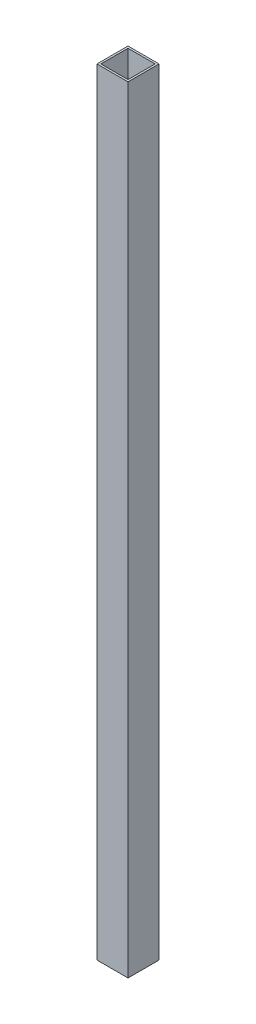
ISO-10303-21;
HEADER;
FILE_DESCRIPTION(('STEP AP214'),'2;1');
FILE_NAME('part.step','',(''),(''),'','','');
FILE_SCHEMA(('AUTOMOTIVE_DESIGN { 1 0 10303 214 1 1 1 1 }'));
ENDSEC;
DATA;
#1=APPLICATION_CONTEXT('core data for automotive mechanical design processes');
#2=APPLICATION_PROTOCOL_DEFINITION('international standard','automotive_design',2000,#1);
#3=PRODUCT_CONTEXT('',#1,'mechanical');
#4=PRODUCT('Part','Part','',(#3));
#5=PRODUCT_RELATED_PRODUCT_CATEGORY('part','',(#4));
#6=PRODUCT_DEFINITION_FORMATION('','',#4);
#7=PRODUCT_DEFINITION_CONTEXT('part definition',#1,'design');
#8=PRODUCT_DEFINITION('design','',#6,#7);
#9=PRODUCT_DEFINITION_SHAPE('','',#8);
#10=(LENGTH_UNIT() NAMED_UNIT(*) SI_UNIT(.MILLI.,.METRE.));
#11=(NAMED_UNIT(*) PLANE_ANGLE_UNIT() SI_UNIT($,.RADIAN.));
#12=(NAMED_UNIT(*) SI_UNIT($,.STERADIAN.) SOLID_ANGLE_UNIT());
#13=UNCERTAINTY_MEASURE_WITH_UNIT(LENGTH_MEASURE(1.E-05),#10,'distance_accuracy_value','');
#14=(GEOMETRIC_REPRESENTATION_CONTEXT(3) GLOBAL_UNCERTAINTY_ASSIGNED_CONTEXT((#13)) GLOBAL_UNIT_ASSIGNED_CONTEXT((#10,
#11,#12)) REPRESENTATION_CONTEXT('',''));
#15=CARTESIAN_POINT('',(0.,0.,0.));
#16=DIRECTION('',(0.,0.,1.));
#17=DIRECTION('',(1.,0.,0.));
#18=AXIS2_PLACEMENT_3D('',#15,#16,#17);
#19=CARTESIAN_POINT('',(0.,635.,0.));
#20=DIRECTION('',(0.,-1.,0.));
#21=DIRECTION('',(0.,0.,-1.));
#22=AXIS2_PLACEMENT_3D('',#19,#20,#21);
#23=PLANE('',#22);
#24=DIRECTION('',(0.,0.,1.));
#25=VECTOR('',#24,1.);
#26=CARTESIAN_POINT('',(-12.7,635.,-12.7));
#27=LINE('',#26,#25);
#28=CARTESIAN_POINT('',(-12.7,635.,-12.7));
#29=VERTEX_POINT('',#28);
#30=CARTESIAN_POINT('',(-12.7,635.,12.7));
#31=VERTEX_POINT('',#30);
#32=EDGE_CURVE('E133',#29,#31,#27,.T.);
#33=ORIENTED_EDGE('',*,*,#32,.T.);
#34=DIRECTION('',(1.,0.,0.));
#35=VECTOR('',#34,1.);
#36=CARTESIAN_POINT('',(12.7,635.,12.7));
#37=LINE('',#36,#35);
#38=CARTESIAN_POINT('',(12.7,635.,12.7));
#39=VERTEX_POINT('',#38);
#40=EDGE_CURVE('E136',#31,#39,#37,.T.);
#41=ORIENTED_EDGE('',*,*,#40,.T.);
#42=DIRECTION('',(0.,0.,-1.));
#43=VECTOR('',#42,1.);
#44=CARTESIAN_POINT('',(12.7,635.,-12.7));
#45=LINE('',#44,#43);
#46=CARTESIAN_POINT('',(12.7,635.,-12.7));
#47=VERTEX_POINT('',#46);
#48=EDGE_CURVE('E139',#39,#47,#45,.T.);
#49=ORIENTED_EDGE('',*,*,#48,.T.);
#50=DIRECTION('',(-1.,0.,0.));
#51=VECTOR('',#50,1.);
#52=CARTESIAN_POINT('',(12.7,635.,-12.7));
#53=LINE('',#52,#51);
#54=EDGE_CURVE('E141',#47,#29,#53,.T.);
#55=ORIENTED_EDGE('',*,*,#54,.T.);
#56=EDGE_LOOP('',(#33,#41,#49,#55));
#57=FACE_BOUND('',#56,.T.);
#58=DIRECTION('',(0.,0.,1.));
#59=VECTOR('',#58,1.);
#60=CARTESIAN_POINT('',(-11.1125,635.,-11.1125));
#61=LINE('',#60,#59);
#62=CARTESIAN_POINT('',(-11.1125,635.,-11.1125));
#63=VERTEX_POINT('',#62);
#64=CARTESIAN_POINT('',(-11.1125,635.,11.1125));
#65=VERTEX_POINT('',#64);
#66=EDGE_CURVE('E97',#63,#65,#61,.T.);
#67=ORIENTED_EDGE('',*,*,#66,.F.);
#68=DIRECTION('',(-1.,0.,0.));
#69=VECTOR('',#68,1.);
#70=CARTESIAN_POINT('',(11.1125,635.,-11.1125));
#71=LINE('',#70,#69);
#72=CARTESIAN_POINT('',(11.1125,635.,-11.1125));
#73=VERTEX_POINT('',#72);
#74=EDGE_CURVE('E119',#73,#63,#71,.T.);
#75=ORIENTED_EDGE('',*,*,#74,.F.);
#76=DIRECTION('',(0.,0.,-1.));
#77=VECTOR('',#76,1.);
#78=CARTESIAN_POINT('',(11.1125,635.,-11.1125));
#79=LINE('',#78,#77);
#80=CARTESIAN_POINT('',(11.1125,635.,11.1125));
#81=VERTEX_POINT('',#80);
#82=EDGE_CURVE('E117',#81,#73,#79,.T.);
#83=ORIENTED_EDGE('',*,*,#82,.F.);
#84=DIRECTION('',(1.,0.,0.));
#85=VECTOR('',#84,1.);
#86=CARTESIAN_POINT('',(11.1125,635.,11.1125));
#87=LINE('',#86,#85);
#88=EDGE_CURVE('E105',#65,#81,#87,.T.);
#89=ORIENTED_EDGE('',*,*,#88,.F.);
#90=EDGE_LOOP('',(#67,#75,#83,#89));
#91=FACE_BOUND('',#90,.T.);
#92=ADVANCED_FACE('F32',(#57,#91),#23,.F.);
#93=CARTESIAN_POINT('',(0.,0.,0.));
#94=DIRECTION('',(0.,-1.,0.));
#95=DIRECTION('',(0.,0.,-1.));
#96=AXIS2_PLACEMENT_3D('',#93,#94,#95);
#97=PLANE('',#96);
#98=DIRECTION('',(0.,0.,1.));
#99=VECTOR('',#98,1.);
#100=CARTESIAN_POINT('',(-12.7,0.,-12.7));
#101=LINE('',#100,#99);
#102=CARTESIAN_POINT('',(-12.7,0.,-12.7));
#103=VERTEX_POINT('',#102);
#104=CARTESIAN_POINT('',(-12.7,0.,12.7));
#105=VERTEX_POINT('',#104);
#106=EDGE_CURVE('E113',#103,#105,#101,.T.);
#107=ORIENTED_EDGE('',*,*,#106,.F.);
#108=DIRECTION('',(-1.,0.,0.));
#109=VECTOR('',#108,1.);
#110=CARTESIAN_POINT('',(12.7,0.,-12.7));
#111=LINE('',#110,#109);
#112=CARTESIAN_POINT('',(12.7,0.,-12.7));
#113=VERTEX_POINT('',#112);
#114=EDGE_CURVE('E137',#113,#103,#111,.T.);
#115=ORIENTED_EDGE('',*,*,#114,.F.);
#116=DIRECTION('',(0.,0.,-1.));
#117=VECTOR('',#116,1.);
#118=CARTESIAN_POINT('',(12.7,0.,-12.7));
#119=LINE('',#118,#117);
#120=CARTESIAN_POINT('',(12.7,0.,12.7));
#121=VERTEX_POINT('',#120);
#122=EDGE_CURVE('E148',#121,#113,#119,.T.);
#123=ORIENTED_EDGE('',*,*,#122,.F.);
#124=DIRECTION('',(1.,0.,0.));
#125=VECTOR('',#124,1.);
#126=CARTESIAN_POINT('',(12.7,0.,12.7));
#127=LINE('',#126,#125);
#128=EDGE_CURVE('E146',#105,#121,#127,.T.);
#129=ORIENTED_EDGE('',*,*,#128,.F.);
#130=EDGE_LOOP('',(#107,#115,#123,#129));
#131=FACE_BOUND('',#130,.T.);
#132=DIRECTION('',(-1.,0.,0.));
#133=VECTOR('',#132,1.);
#134=CARTESIAN_POINT('',(11.1125,0.,-11.1125));
#135=LINE('',#134,#133);
#136=CARTESIAN_POINT('',(11.1125,0.,-11.1125));
#137=VERTEX_POINT('',#136);
#138=CARTESIAN_POINT('',(-11.1125,0.,-11.1125));
#139=VERTEX_POINT('',#138);
#140=EDGE_CURVE('E106',#137,#139,#135,.T.);
#141=ORIENTED_EDGE('',*,*,#140,.T.);
#142=DIRECTION('',(0.,0.,1.));
#143=VECTOR('',#142,1.);
#144=CARTESIAN_POINT('',(-11.1125,0.,-11.1125));
#145=LINE('',#144,#143);
#146=CARTESIAN_POINT('',(-11.1125,0.,11.1125));
#147=VERTEX_POINT('',#146);
#148=EDGE_CURVE('E55',#139,#147,#145,.T.);
#149=ORIENTED_EDGE('',*,*,#148,.T.);
#150=DIRECTION('',(1.,0.,0.));
#151=VECTOR('',#150,1.);
#152=CARTESIAN_POINT('',(11.1125,0.,11.1125));
#153=LINE('',#152,#151);
#154=CARTESIAN_POINT('',(11.1125,0.,11.1125));
#155=VERTEX_POINT('',#154);
#156=EDGE_CURVE('E112',#147,#155,#153,.T.);
#157=ORIENTED_EDGE('',*,*,#156,.T.);
#158=DIRECTION('',(0.,0.,-1.));
#159=VECTOR('',#158,1.);
#160=CARTESIAN_POINT('',(11.1125,0.,-11.1125));
#161=LINE('',#160,#159);
#162=EDGE_CURVE('E125',#155,#137,#161,.T.);
#163=ORIENTED_EDGE('',*,*,#162,.T.);
#164=EDGE_LOOP('',(#141,#149,#157,#163));
#165=FACE_BOUND('',#164,.T.);
#166=ADVANCED_FACE('F166',(#131,#165),#97,.T.);
#167=CARTESIAN_POINT('',(-12.7,635.,-12.7));
#168=DIRECTION('',(1.,0.,0.));
#169=DIRECTION('',(0.,0.,-1.));
#170=AXIS2_PLACEMENT_3D('',#167,#168,#169);
#171=PLANE('',#170);
#172=ORIENTED_EDGE('',*,*,#106,.T.);
#173=DIRECTION('',(0.,-1.,0.));
#174=VECTOR('',#173,1.);
#175=CARTESIAN_POINT('',(-12.7,635.,12.7));
#176=LINE('',#175,#174);
#177=EDGE_CURVE('E11',#31,#105,#176,.T.);
#178=ORIENTED_EDGE('',*,*,#177,.F.);
#179=ORIENTED_EDGE('',*,*,#32,.F.);
#180=DIRECTION('',(0.,-1.,0.));
#181=VECTOR('',#180,1.);
#182=CARTESIAN_POINT('',(-12.7,635.,-12.7));
#183=LINE('',#182,#181);
#184=EDGE_CURVE('E143',#29,#103,#183,.T.);
#185=ORIENTED_EDGE('',*,*,#184,.T.);
#186=EDGE_LOOP('',(#172,#178,#179,#185));
#187=FACE_BOUND('',#186,.T.);
#188=ADVANCED_FACE('F34',(#187),#171,.F.);
#189=CARTESIAN_POINT('',(12.7,635.,12.7));
#190=DIRECTION('',(0.,0.,-1.));
#191=DIRECTION('',(-1.,0.,0.));
#192=AXIS2_PLACEMENT_3D('',#189,#190,#191);
#193=PLANE('',#192);
#194=ORIENTED_EDGE('',*,*,#128,.T.);
#195=DIRECTION('',(0.,-1.,0.));
#196=VECTOR('',#195,1.);
#197=CARTESIAN_POINT('',(12.7,635.,12.7));
#198=LINE('',#197,#196);
#199=EDGE_CURVE('E40',#39,#121,#198,.T.);
#200=ORIENTED_EDGE('',*,*,#199,.F.);
#201=ORIENTED_EDGE('',*,*,#40,.F.);
#202=ORIENTED_EDGE('',*,*,#177,.T.);
#203=EDGE_LOOP('',(#194,#200,#201,#202));
#204=FACE_BOUND('',#203,.T.);
#205=ADVANCED_FACE('F176',(#204),#193,.F.);
#206=CARTESIAN_POINT('',(12.7,635.,-12.7));
#207=DIRECTION('',(-1.,0.,0.));
#208=DIRECTION('',(0.,0.,1.));
#209=AXIS2_PLACEMENT_3D('',#206,#207,#208);
#210=PLANE('',#209);
#211=ORIENTED_EDGE('',*,*,#122,.T.);
#212=DIRECTION('',(0.,-1.,0.));
#213=VECTOR('',#212,1.);
#214=CARTESIAN_POINT('',(12.7,635.,-12.7));
#215=LINE('',#214,#213);
#216=EDGE_CURVE('E153',#47,#113,#215,.T.);
#217=ORIENTED_EDGE('',*,*,#216,.F.);
#218=ORIENTED_EDGE('',*,*,#48,.F.);
#219=ORIENTED_EDGE('',*,*,#199,.T.);
#220=EDGE_LOOP('',(#211,#217,#218,#219));
#221=FACE_BOUND('',#220,.T.);
#222=ADVANCED_FACE('F160',(#221),#210,.F.);
#223=CARTESIAN_POINT('',(12.7,635.,-12.7));
#224=DIRECTION('',(0.,0.,1.));
#225=DIRECTION('',(1.,0.,0.));
#226=AXIS2_PLACEMENT_3D('',#223,#224,#225);
#227=PLANE('',#226);
#228=ORIENTED_EDGE('',*,*,#114,.T.);
#229=ORIENTED_EDGE('',*,*,#184,.F.);
#230=ORIENTED_EDGE('',*,*,#54,.F.);
#231=ORIENTED_EDGE('',*,*,#216,.T.);
#232=EDGE_LOOP('',(#228,#229,#230,#231));
#233=FACE_BOUND('',#232,.T.);
#234=ADVANCED_FACE('F170',(#233),#227,.F.);
#235=CARTESIAN_POINT('',(-11.1125,635.,-11.1125));
#236=DIRECTION('',(1.,0.,0.));
#237=DIRECTION('',(0.,0.,-1.));
#238=AXIS2_PLACEMENT_3D('',#235,#236,#237);
#239=PLANE('',#238);
#240=ORIENTED_EDGE('',*,*,#148,.F.);
#241=DIRECTION('',(0.,-1.,0.));
#242=VECTOR('',#241,1.);
#243=CARTESIAN_POINT('',(-11.1125,635.,-11.1125));
#244=LINE('',#243,#242);
#245=EDGE_CURVE('E101',#63,#139,#244,.T.);
#246=ORIENTED_EDGE('',*,*,#245,.F.);
#247=ORIENTED_EDGE('',*,*,#66,.T.);
#248=DIRECTION('',(0.,-1.,0.));
#249=VECTOR('',#248,1.);
#250=CARTESIAN_POINT('',(-11.1125,635.,11.1125));
#251=LINE('',#250,#249);
#252=EDGE_CURVE('E100',#65,#147,#251,.T.);
#253=ORIENTED_EDGE('',*,*,#252,.T.);
#254=EDGE_LOOP('',(#240,#246,#247,#253));
#255=FACE_BOUND('',#254,.T.);
#256=ADVANCED_FACE('F99',(#255),#239,.T.);
#257=CARTESIAN_POINT('',(11.1125,635.,11.1125));
#258=DIRECTION('',(0.,0.,-1.));
#259=DIRECTION('',(-1.,0.,0.));
#260=AXIS2_PLACEMENT_3D('',#257,#258,#259);
#261=PLANE('',#260);
#262=ORIENTED_EDGE('',*,*,#156,.F.);
#263=ORIENTED_EDGE('',*,*,#252,.F.);
#264=ORIENTED_EDGE('',*,*,#88,.T.);
#265=DIRECTION('',(0.,-1.,0.));
#266=VECTOR('',#265,1.);
#267=CARTESIAN_POINT('',(11.1125,635.,11.1125));
#268=LINE('',#267,#266);
#269=EDGE_CURVE('E114',#81,#155,#268,.T.);
#270=ORIENTED_EDGE('',*,*,#269,.T.);
#271=EDGE_LOOP('',(#262,#263,#264,#270));
#272=FACE_BOUND('',#271,.T.);
#273=ADVANCED_FACE('F109',(#272),#261,.T.);
#274=CARTESIAN_POINT('',(11.1125,635.,-11.1125));
#275=DIRECTION('',(-1.,0.,0.));
#276=DIRECTION('',(0.,0.,1.));
#277=AXIS2_PLACEMENT_3D('',#274,#275,#276);
#278=PLANE('',#277);
#279=ORIENTED_EDGE('',*,*,#162,.F.);
#280=ORIENTED_EDGE('',*,*,#269,.F.);
#281=ORIENTED_EDGE('',*,*,#82,.T.);
#282=DIRECTION('',(0.,-1.,0.));
#283=VECTOR('',#282,1.);
#284=CARTESIAN_POINT('',(11.1125,635.,-11.1125));
#285=LINE('',#284,#283);
#286=EDGE_CURVE('E47',#73,#137,#285,.T.);
#287=ORIENTED_EDGE('',*,*,#286,.T.);
#288=EDGE_LOOP('',(#279,#280,#281,#287));
#289=FACE_BOUND('',#288,.T.);
#290=ADVANCED_FACE('F199',(#289),#278,.T.);
#291=CARTESIAN_POINT('',(11.1125,635.,-11.1125));
#292=DIRECTION('',(0.,0.,1.));
#293=DIRECTION('',(1.,0.,0.));
#294=AXIS2_PLACEMENT_3D('',#291,#292,#293);
#295=PLANE('',#294);
#296=ORIENTED_EDGE('',*,*,#140,.F.);
#297=ORIENTED_EDGE('',*,*,#286,.F.);
#298=ORIENTED_EDGE('',*,*,#74,.T.);
#299=ORIENTED_EDGE('',*,*,#245,.T.);
#300=EDGE_LOOP('',(#296,#297,#298,#299));
#301=FACE_BOUND('',#300,.T.);
#302=ADVANCED_FACE('F203',(#301),#295,.T.);
#303=CLOSED_SHELL('',(#92,#166,#188,#205,#222,#234,#256,#273,#290,#302));
#304=MANIFOLD_SOLID_BREP('B2',#303);
#305=ADVANCED_BREP_SHAPE_REPRESENTATION('',(#18,#304),#14);
#306=SHAPE_DEFINITION_REPRESENTATION(#9,#305);
ENDSEC;
END-ISO-10303-21;
